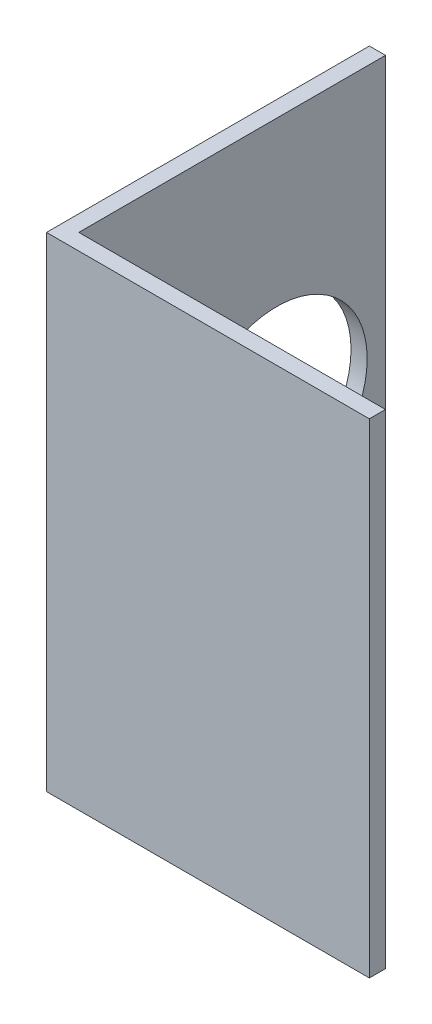
ISO-10303-21;
HEADER;
FILE_DESCRIPTION(('STEP AP214'),'2;1');
FILE_NAME('part.step','',(''),(''),'','','');
FILE_SCHEMA(('AUTOMOTIVE_DESIGN { 1 0 10303 214 1 1 1 1 }'));
ENDSEC;
DATA;
#1=APPLICATION_CONTEXT('core data for automotive mechanical design processes');
#2=APPLICATION_PROTOCOL_DEFINITION('international standard','automotive_design',2000,#1);
#3=PRODUCT_CONTEXT('',#1,'mechanical');
#4=PRODUCT('Part','Part','',(#3));
#5=PRODUCT_RELATED_PRODUCT_CATEGORY('part','',(#4));
#6=PRODUCT_DEFINITION_FORMATION('','',#4);
#7=PRODUCT_DEFINITION_CONTEXT('part definition',#1,'design');
#8=PRODUCT_DEFINITION('design','',#6,#7);
#9=PRODUCT_DEFINITION_SHAPE('','',#8);
#10=(LENGTH_UNIT() NAMED_UNIT(*) SI_UNIT(.MILLI.,.METRE.));
#11=(NAMED_UNIT(*) PLANE_ANGLE_UNIT() SI_UNIT($,.RADIAN.));
#12=(NAMED_UNIT(*) SI_UNIT($,.STERADIAN.) SOLID_ANGLE_UNIT());
#13=UNCERTAINTY_MEASURE_WITH_UNIT(LENGTH_MEASURE(1.E-05),#10,'distance_accuracy_value','');
#14=(GEOMETRIC_REPRESENTATION_CONTEXT(3) GLOBAL_UNCERTAINTY_ASSIGNED_CONTEXT((#13)) GLOBAL_UNIT_ASSIGNED_CONTEXT((#10,
#11,#12)) REPRESENTATION_CONTEXT('',''));
#15=CARTESIAN_POINT('',(0.,0.,0.));
#16=DIRECTION('',(0.,0.,1.));
#17=DIRECTION('',(1.,0.,0.));
#18=AXIS2_PLACEMENT_3D('',#15,#16,#17);
#19=CARTESIAN_POINT('',(-18.0835884415933,76.2,-27.1615011858616));
#20=DIRECTION('',(0.,0.,1.));
#21=DIRECTION('',(1.,0.,0.));
#22=AXIS2_PLACEMENT_3D('',#19,#20,#21);
#23=PLANE('',#22);
#24=DIRECTION('',(-1.,0.,0.));
#25=VECTOR('',#24,1.);
#26=CARTESIAN_POINT('',(-18.0835884415933,0.,-27.1615011858616));
#27=LINE('',#26,#25);
#28=CARTESIAN_POINT('',(-18.0835884415933,0.,-27.1615011858616));
#29=VERTEX_POINT('',#28);
#30=CARTESIAN_POINT('',(-20.6235884415933,0.,-27.1615011858616));
#31=VERTEX_POINT('',#30);
#32=EDGE_CURVE('E115',#29,#31,#27,.T.);
#33=ORIENTED_EDGE('',*,*,#32,.T.);
#34=DIRECTION('',(0.,-1.,0.));
#35=VECTOR('',#34,1.);
#36=CARTESIAN_POINT('',(-20.6235884415933,76.2,-27.1615011858616));
#37=LINE('',#36,#35);
#38=CARTESIAN_POINT('',(-20.6235884415933,76.2,-27.1615011858616));
#39=VERTEX_POINT('',#38);
#40=EDGE_CURVE('E11',#39,#31,#37,.T.);
#41=ORIENTED_EDGE('',*,*,#40,.F.);
#42=DIRECTION('',(-1.,0.,0.));
#43=VECTOR('',#42,1.);
#44=CARTESIAN_POINT('',(-18.0835884415933,76.2,-27.1615011858616));
#45=LINE('',#44,#43);
#46=CARTESIAN_POINT('',(-18.0835884415933,76.2,-27.1615011858616));
#47=VERTEX_POINT('',#46);
#48=EDGE_CURVE('E126',#47,#39,#45,.T.);
#49=ORIENTED_EDGE('',*,*,#48,.F.);
#50=DIRECTION('',(0.,-1.,0.));
#51=VECTOR('',#50,1.);
#52=CARTESIAN_POINT('',(-18.0835884415933,76.2,-27.1615011858616));
#53=LINE('',#52,#51);
#54=EDGE_CURVE('E111',#47,#29,#53,.T.);
#55=ORIENTED_EDGE('',*,*,#54,.T.);
#56=EDGE_LOOP('',(#33,#41,#49,#55));
#57=FACE_BOUND('',#56,.T.);
#58=ADVANCED_FACE('F31',(#57),#23,.F.);
#59=CARTESIAN_POINT('',(-20.6235884415933,76.2,-27.1615011858616));
#60=DIRECTION('',(1.,0.,0.));
#61=DIRECTION('',(0.,0.,-1.));
#62=AXIS2_PLACEMENT_3D('',#59,#60,#61);
#63=PLANE('',#62);
#64=CARTESIAN_POINT('',(-20.6235884415933,36.2998237750449,-10.0532219795937));
#65=DIRECTION('',(1.,0.,0.));
#66=DIRECTION('',(0.,0.,-1.));
#67=AXIS2_PLACEMENT_3D('',#64,#65,#66);
#68=CIRCLE('',#67,14.224);
#69=CARTESIAN_POINT('',(-20.6235884415933,36.2998237750449,-24.2772219795937));
#70=VERTEX_POINT('',#69);
#71=EDGE_CURVE('E119',#70,#70,#68,.T.);
#72=ORIENTED_EDGE('',*,*,#71,.T.);
#73=EDGE_LOOP('',(#72));
#74=FACE_BOUND('',#73,.T.);
#75=DIRECTION('',(0.,0.,1.));
#76=VECTOR('',#75,1.);
#77=CARTESIAN_POINT('',(-20.6235884415933,0.,-27.1615011858616));
#78=LINE('',#77,#76);
#79=CARTESIAN_POINT('',(-20.6235884415933,0.,23.6384988141384));
#80=VERTEX_POINT('',#79);
#81=EDGE_CURVE('E118',#31,#80,#78,.T.);
#82=ORIENTED_EDGE('',*,*,#81,.T.);
#83=DIRECTION('',(0.,-1.,0.));
#84=VECTOR('',#83,1.);
#85=CARTESIAN_POINT('',(-20.6235884415933,76.2,23.6384988141384));
#86=LINE('',#85,#84);
#87=CARTESIAN_POINT('',(-20.6235884415933,76.2,23.6384988141384));
#88=VERTEX_POINT('',#87);
#89=EDGE_CURVE('E39',#88,#80,#86,.T.);
#90=ORIENTED_EDGE('',*,*,#89,.F.);
#91=DIRECTION('',(0.,0.,1.));
#92=VECTOR('',#91,1.);
#93=CARTESIAN_POINT('',(-20.6235884415933,76.2,-27.1615011858616));
#94=LINE('',#93,#92);
#95=EDGE_CURVE('E84',#39,#88,#94,.T.);
#96=ORIENTED_EDGE('',*,*,#95,.F.);
#97=ORIENTED_EDGE('',*,*,#40,.T.);
#98=EDGE_LOOP('',(#82,#90,#96,#97));
#99=FACE_BOUND('',#98,.T.);
#100=ADVANCED_FACE('F152',(#74,#99),#63,.F.);
#101=CARTESIAN_POINT('',(-20.6235884415933,76.2,23.6384988141384));
#102=DIRECTION('',(0.,0.,-1.));
#103=DIRECTION('',(-1.,0.,0.));
#104=AXIS2_PLACEMENT_3D('',#101,#102,#103);
#105=PLANE('',#104);
#106=DIRECTION('',(1.,0.,0.));
#107=VECTOR('',#106,1.);
#108=CARTESIAN_POINT('',(-20.6235884415933,0.,23.6384988141384));
#109=LINE('',#108,#107);
#110=CARTESIAN_POINT('',(30.1764115584067,0.,23.6384988141384));
#111=VERTEX_POINT('',#110);
#112=EDGE_CURVE('E121',#80,#111,#109,.T.);
#113=ORIENTED_EDGE('',*,*,#112,.T.);
#114=DIRECTION('',(0.,-1.,0.));
#115=VECTOR('',#114,1.);
#116=CARTESIAN_POINT('',(30.1764115584067,76.2,23.6384988141384));
#117=LINE('',#116,#115);
#118=CARTESIAN_POINT('',(30.1764115584067,76.2,23.6384988141384));
#119=VERTEX_POINT('',#118);
#120=EDGE_CURVE('E106',#119,#111,#117,.T.);
#121=ORIENTED_EDGE('',*,*,#120,.F.);
#122=DIRECTION('',(1.,0.,0.));
#123=VECTOR('',#122,1.);
#124=CARTESIAN_POINT('',(-20.6235884415933,76.2,23.6384988141384));
#125=LINE('',#124,#123);
#126=EDGE_CURVE('E97',#88,#119,#125,.T.);
#127=ORIENTED_EDGE('',*,*,#126,.F.);
#128=ORIENTED_EDGE('',*,*,#89,.T.);
#129=EDGE_LOOP('',(#113,#121,#127,#128));
#130=FACE_BOUND('',#129,.T.);
#131=ADVANCED_FACE('F132',(#130),#105,.F.);
#132=CARTESIAN_POINT('',(30.1764115584067,76.2,23.6384988141384));
#133=DIRECTION('',(-1.,0.,0.));
#134=DIRECTION('',(0.,0.,1.));
#135=AXIS2_PLACEMENT_3D('',#132,#133,#134);
#136=PLANE('',#135);
#137=DIRECTION('',(0.,0.,-1.));
#138=VECTOR('',#137,1.);
#139=CARTESIAN_POINT('',(30.1764115584067,0.,23.6384988141384));
#140=LINE('',#139,#138);
#141=CARTESIAN_POINT('',(30.1764115584067,0.,21.0984988141384));
#142=VERTEX_POINT('',#141);
#143=EDGE_CURVE('E105',#111,#142,#140,.T.);
#144=ORIENTED_EDGE('',*,*,#143,.T.);
#145=DIRECTION('',(0.,-1.,0.));
#146=VECTOR('',#145,1.);
#147=CARTESIAN_POINT('',(30.1764115584067,76.2,21.0984988141384));
#148=LINE('',#147,#146);
#149=CARTESIAN_POINT('',(30.1764115584067,76.2,21.0984988141384));
#150=VERTEX_POINT('',#149);
#151=EDGE_CURVE('E102',#150,#142,#148,.T.);
#152=ORIENTED_EDGE('',*,*,#151,.F.);
#153=DIRECTION('',(0.,0.,-1.));
#154=VECTOR('',#153,1.);
#155=CARTESIAN_POINT('',(30.1764115584067,76.2,23.6384988141384));
#156=LINE('',#155,#154);
#157=EDGE_CURVE('E91',#119,#150,#156,.T.);
#158=ORIENTED_EDGE('',*,*,#157,.F.);
#159=ORIENTED_EDGE('',*,*,#120,.T.);
#160=EDGE_LOOP('',(#144,#152,#158,#159));
#161=FACE_BOUND('',#160,.T.);
#162=ADVANCED_FACE('F103',(#161),#136,.F.);
#163=CARTESIAN_POINT('',(30.1764115584067,76.2,21.0984988141384));
#164=DIRECTION('',(0.,0.,1.));
#165=DIRECTION('',(1.,0.,0.));
#166=AXIS2_PLACEMENT_3D('',#163,#164,#165);
#167=PLANE('',#166);
#168=DIRECTION('',(-1.,0.,0.));
#169=VECTOR('',#168,1.);
#170=CARTESIAN_POINT('',(30.1764115584067,0.,21.0984988141384));
#171=LINE('',#170,#169);
#172=CARTESIAN_POINT('',(-18.0835884415933,0.,21.0984988141384));
#173=VERTEX_POINT('',#172);
#174=EDGE_CURVE('E70',#142,#173,#171,.T.);
#175=ORIENTED_EDGE('',*,*,#174,.T.);
#176=DIRECTION('',(0.,-1.,0.));
#177=VECTOR('',#176,1.);
#178=CARTESIAN_POINT('',(-18.0835884415933,76.2,21.0984988141384));
#179=LINE('',#178,#177);
#180=CARTESIAN_POINT('',(-18.0835884415933,76.2,21.0984988141384));
#181=VERTEX_POINT('',#180);
#182=EDGE_CURVE('E107',#181,#173,#179,.T.);
#183=ORIENTED_EDGE('',*,*,#182,.F.);
#184=DIRECTION('',(-1.,0.,0.));
#185=VECTOR('',#184,1.);
#186=CARTESIAN_POINT('',(30.1764115584067,76.2,21.0984988141384));
#187=LINE('',#186,#185);
#188=EDGE_CURVE('E95',#150,#181,#187,.T.);
#189=ORIENTED_EDGE('',*,*,#188,.F.);
#190=ORIENTED_EDGE('',*,*,#151,.T.);
#191=EDGE_LOOP('',(#175,#183,#189,#190));
#192=FACE_BOUND('',#191,.T.);
#193=ADVANCED_FACE('F109',(#192),#167,.F.);
#194=CARTESIAN_POINT('',(-18.0835884415933,76.2,21.0984988141384));
#195=DIRECTION('',(-1.,0.,0.));
#196=DIRECTION('',(0.,0.,1.));
#197=AXIS2_PLACEMENT_3D('',#194,#195,#196);
#198=PLANE('',#197);
#199=CARTESIAN_POINT('',(-18.0835884415933,36.2998237750449,-10.0532219795937));
#200=DIRECTION('',(1.,0.,0.));
#201=DIRECTION('',(0.,0.,-1.));
#202=AXIS2_PLACEMENT_3D('',#199,#200,#201);
#203=CIRCLE('',#202,14.224);
#204=CARTESIAN_POINT('',(-18.0835884415933,36.2998237750449,-24.2772219795937));
#205=VERTEX_POINT('',#204);
#206=EDGE_CURVE('E212',#205,#205,#203,.T.);
#207=ORIENTED_EDGE('',*,*,#206,.F.);
#208=EDGE_LOOP('',(#207));
#209=FACE_BOUND('',#208,.T.);
#210=DIRECTION('',(0.,0.,-1.));
#211=VECTOR('',#210,1.);
#212=CARTESIAN_POINT('',(-18.0835884415933,0.,21.0984988141384));
#213=LINE('',#212,#211);
#214=EDGE_CURVE('E76',#173,#29,#213,.T.);
#215=ORIENTED_EDGE('',*,*,#214,.T.);
#216=ORIENTED_EDGE('',*,*,#54,.F.);
#217=DIRECTION('',(0.,0.,-1.));
#218=VECTOR('',#217,1.);
#219=CARTESIAN_POINT('',(-18.0835884415933,76.2,21.0984988141384));
#220=LINE('',#219,#218);
#221=EDGE_CURVE('E47',#181,#47,#220,.T.);
#222=ORIENTED_EDGE('',*,*,#221,.F.);
#223=ORIENTED_EDGE('',*,*,#182,.T.);
#224=EDGE_LOOP('',(#215,#216,#222,#223));
#225=FACE_BOUND('',#224,.T.);
#226=ADVANCED_FACE('F139',(#209,#225),#198,.F.);
#227=CARTESIAN_POINT('',(-20.6235884415933,76.2,-27.1615011858616));
#228=DIRECTION('',(0.,1.,0.));
#229=DIRECTION('',(0.,0.,1.));
#230=AXIS2_PLACEMENT_3D('',#227,#228,#229);
#231=PLANE('',#230);
#232=ORIENTED_EDGE('',*,*,#48,.T.);
#233=ORIENTED_EDGE('',*,*,#95,.T.);
#234=ORIENTED_EDGE('',*,*,#126,.T.);
#235=ORIENTED_EDGE('',*,*,#157,.T.);
#236=ORIENTED_EDGE('',*,*,#188,.T.);
#237=ORIENTED_EDGE('',*,*,#221,.T.);
#238=EDGE_LOOP('',(#232,#233,#234,#235,#236,#237));
#239=FACE_BOUND('',#238,.T.);
#240=ADVANCED_FACE('F93',(#239),#231,.T.);
#241=CARTESIAN_POINT('',(-20.6235884415933,0.,-27.1615011858616));
#242=DIRECTION('',(0.,1.,0.));
#243=DIRECTION('',(0.,0.,1.));
#244=AXIS2_PLACEMENT_3D('',#241,#242,#243);
#245=PLANE('',#244);
#246=ORIENTED_EDGE('',*,*,#32,.F.);
#247=ORIENTED_EDGE('',*,*,#214,.F.);
#248=ORIENTED_EDGE('',*,*,#174,.F.);
#249=ORIENTED_EDGE('',*,*,#143,.F.);
#250=ORIENTED_EDGE('',*,*,#112,.F.);
#251=ORIENTED_EDGE('',*,*,#81,.F.);
#252=EDGE_LOOP('',(#246,#247,#248,#249,#250,#251));
#253=FACE_BOUND('',#252,.T.);
#254=ADVANCED_FACE('F135',(#253),#245,.F.);
#255=CARTESIAN_POINT('',(-20.6235884415933,36.2998237750449,-10.0532219795937));
#256=DIRECTION('',(1.,0.,0.));
#257=DIRECTION('',(0.,0.,-1.));
#258=AXIS2_PLACEMENT_3D('',#255,#256,#257);
#259=CYLINDRICAL_SURFACE('',#258,14.224);
#260=ORIENTED_EDGE('',*,*,#71,.F.);
#261=EDGE_LOOP('',(#260));
#262=FACE_BOUND('',#261,.T.);
#263=ORIENTED_EDGE('',*,*,#206,.T.);
#264=EDGE_LOOP('',(#263));
#265=FACE_BOUND('',#264,.T.);
#266=ADVANCED_FACE('F187',(#262,#265),#259,.F.);
#267=CLOSED_SHELL('',(#58,#100,#131,#162,#193,#226,#240,#254,#266));
#268=MANIFOLD_SOLID_BREP('B2',#267);
#269=ADVANCED_BREP_SHAPE_REPRESENTATION('',(#18,#268),#14);
#270=SHAPE_DEFINITION_REPRESENTATION(#9,#269);
ENDSEC;
END-ISO-10303-21;
